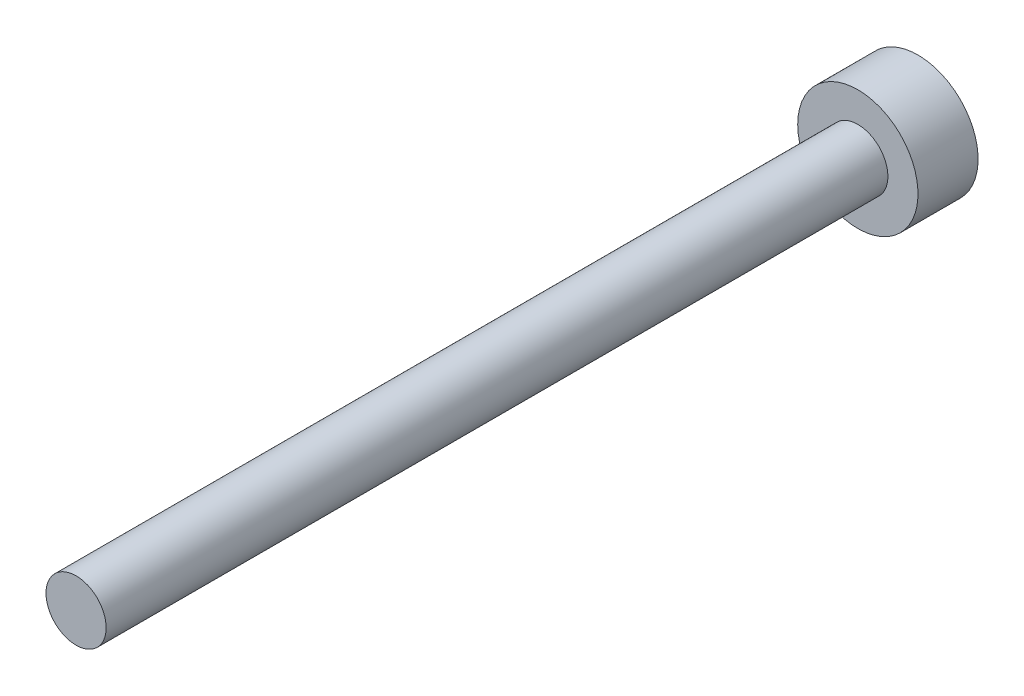
ISO-10303-21;
HEADER;
FILE_DESCRIPTION(('STEP AP214'),'2;1');
FILE_NAME('part.step','',(''),(''),'','','');
FILE_SCHEMA(('AUTOMOTIVE_DESIGN { 1 0 10303 214 1 1 1 1 }'));
ENDSEC;
DATA;
#1=APPLICATION_CONTEXT('core data for automotive mechanical design processes');
#2=APPLICATION_PROTOCOL_DEFINITION('international standard','automotive_design',2000,#1);
#3=PRODUCT_CONTEXT('',#1,'mechanical');
#4=PRODUCT('Part','Part','',(#3));
#5=PRODUCT_RELATED_PRODUCT_CATEGORY('part','',(#4));
#6=PRODUCT_DEFINITION_FORMATION('','',#4);
#7=PRODUCT_DEFINITION_CONTEXT('part definition',#1,'design');
#8=PRODUCT_DEFINITION('design','',#6,#7);
#9=PRODUCT_DEFINITION_SHAPE('','',#8);
#10=(LENGTH_UNIT() NAMED_UNIT(*) SI_UNIT(.MILLI.,.METRE.));
#11=(NAMED_UNIT(*) PLANE_ANGLE_UNIT() SI_UNIT($,.RADIAN.));
#12=(NAMED_UNIT(*) SI_UNIT($,.STERADIAN.) SOLID_ANGLE_UNIT());
#13=UNCERTAINTY_MEASURE_WITH_UNIT(LENGTH_MEASURE(1.E-05),#10,'distance_accuracy_value','');
#14=(GEOMETRIC_REPRESENTATION_CONTEXT(3) GLOBAL_UNCERTAINTY_ASSIGNED_CONTEXT((#13)) GLOBAL_UNIT_ASSIGNED_CONTEXT((#10,
#11,#12)) REPRESENTATION_CONTEXT('',''));
#15=CARTESIAN_POINT('',(0.,0.,0.));
#16=DIRECTION('',(0.,0.,1.));
#17=DIRECTION('',(1.,0.,0.));
#18=AXIS2_PLACEMENT_3D('',#15,#16,#17);
#19=CARTESIAN_POINT('',(0.,0.,52.));
#20=DIRECTION('',(0.,0.,-1.));
#21=DIRECTION('',(-1.,0.,0.));
#22=AXIS2_PLACEMENT_3D('',#19,#20,#21);
#23=CYLINDRICAL_SURFACE('',#22,2.);
#24=CARTESIAN_POINT('',(0.,0.,52.));
#25=DIRECTION('',(0.,0.,1.));
#26=DIRECTION('',(1.,0.,0.));
#27=AXIS2_PLACEMENT_3D('',#24,#25,#26);
#28=CIRCLE('',#27,2.);
#29=CARTESIAN_POINT('',(-2.,0.,52.));
#30=VERTEX_POINT('',#29);
#31=EDGE_CURVE('E11',#30,#30,#28,.T.);
#32=CARTESIAN_POINT('',(0.,0.,0.));
#33=DIRECTION('',(0.,0.,1.));
#34=DIRECTION('',(1.,0.,0.));
#35=AXIS2_PLACEMENT_3D('',#32,#33,#34);
#36=CIRCLE('',#35,2.);
#37=CARTESIAN_POINT('',(-2.,0.,0.));
#38=VERTEX_POINT('',#37);
#39=EDGE_CURVE('E35',#38,#38,#36,.T.);
#40=CARTESIAN_POINT('',(-2.,0.,52.));
#41=CARTESIAN_POINT('',(-2.,0.,51.4583333333333));
#42=CARTESIAN_POINT('',(-2.,0.,50.9166666666667));
#43=CARTESIAN_POINT('',(-2.,0.,49.8333333333333));
#44=CARTESIAN_POINT('',(-2.,0.,49.2916666666667));
#45=CARTESIAN_POINT('',(-2.,0.,48.2083333333333));
#46=CARTESIAN_POINT('',(-2.,0.,47.6666666666667));
#47=CARTESIAN_POINT('',(-2.,0.,46.5833333333333));
#48=CARTESIAN_POINT('',(-2.,0.,46.0416666666667));
#49=CARTESIAN_POINT('',(-2.,0.,44.9583333333333));
#50=CARTESIAN_POINT('',(-2.,0.,44.4166666666667));
#51=CARTESIAN_POINT('',(-2.,0.,43.3333333333333));
#52=CARTESIAN_POINT('',(-2.,0.,42.7916666666667));
#53=CARTESIAN_POINT('',(-2.,0.,41.7083333333333));
#54=CARTESIAN_POINT('',(-2.,0.,41.1666666666667));
#55=CARTESIAN_POINT('',(-2.,0.,40.0833333333333));
#56=CARTESIAN_POINT('',(-2.,0.,39.5416666666667));
#57=CARTESIAN_POINT('',(-2.,0.,38.4583333333333));
#58=CARTESIAN_POINT('',(-2.,0.,37.9166666666667));
#59=CARTESIAN_POINT('',(-2.,0.,36.8333333333333));
#60=CARTESIAN_POINT('',(-2.,0.,36.2916666666667));
#61=CARTESIAN_POINT('',(-2.,0.,35.2083333333333));
#62=CARTESIAN_POINT('',(-2.,0.,34.6666666666667));
#63=CARTESIAN_POINT('',(-2.,0.,33.5833333333333));
#64=CARTESIAN_POINT('',(-2.,0.,33.0416666666667));
#65=CARTESIAN_POINT('',(-2.,0.,31.9583333333333));
#66=CARTESIAN_POINT('',(-2.,0.,31.4166666666667));
#67=CARTESIAN_POINT('',(-2.,0.,30.3333333333333));
#68=CARTESIAN_POINT('',(-2.,0.,29.7916666666667));
#69=CARTESIAN_POINT('',(-2.,0.,28.7083333333333));
#70=CARTESIAN_POINT('',(-2.,0.,28.1666666666667));
#71=CARTESIAN_POINT('',(-2.,0.,27.0833333333333));
#72=CARTESIAN_POINT('',(-2.,0.,26.5416666666667));
#73=CARTESIAN_POINT('',(-2.,0.,25.4583333333333));
#74=CARTESIAN_POINT('',(-2.,0.,24.9166666666667));
#75=CARTESIAN_POINT('',(-2.,0.,23.8333333333333));
#76=CARTESIAN_POINT('',(-2.,0.,23.2916666666667));
#77=CARTESIAN_POINT('',(-2.,0.,22.2083333333333));
#78=CARTESIAN_POINT('',(-2.,0.,21.6666666666667));
#79=CARTESIAN_POINT('',(-2.,0.,20.5833333333333));
#80=CARTESIAN_POINT('',(-2.,0.,20.0416666666667));
#81=CARTESIAN_POINT('',(-2.,0.,18.9583333333333));
#82=CARTESIAN_POINT('',(-2.,0.,18.4166666666667));
#83=CARTESIAN_POINT('',(-2.,0.,17.3333333333333));
#84=CARTESIAN_POINT('',(-2.,0.,16.7916666666667));
#85=CARTESIAN_POINT('',(-2.,0.,15.7083333333333));
#86=CARTESIAN_POINT('',(-2.,0.,15.1666666666667));
#87=CARTESIAN_POINT('',(-2.,0.,14.0833333333333));
#88=CARTESIAN_POINT('',(-2.,0.,13.5416666666667));
#89=CARTESIAN_POINT('',(-2.,0.,12.4583333333333));
#90=CARTESIAN_POINT('',(-2.,0.,11.9166666666667));
#91=CARTESIAN_POINT('',(-2.,0.,10.8333333333333));
#92=CARTESIAN_POINT('',(-2.,0.,10.2916666666667));
#93=CARTESIAN_POINT('',(-2.,0.,9.20833333333333));
#94=CARTESIAN_POINT('',(-2.,0.,8.66666666666667));
#95=CARTESIAN_POINT('',(-2.,0.,7.58333333333333));
#96=CARTESIAN_POINT('',(-2.,0.,7.04166666666667));
#97=CARTESIAN_POINT('',(-2.,0.,5.95833333333333));
#98=CARTESIAN_POINT('',(-2.,0.,5.41666666666667));
#99=CARTESIAN_POINT('',(-2.,0.,4.33333333333333));
#100=CARTESIAN_POINT('',(-2.,0.,3.79166666666667));
#101=CARTESIAN_POINT('',(-2.,0.,2.70833333333334));
#102=CARTESIAN_POINT('',(-2.,0.,2.16666666666667));
#103=CARTESIAN_POINT('',(-2.,0.,1.08333333333333));
#104=CARTESIAN_POINT('',(-2.,0.,0.541666666666667));
#105=CARTESIAN_POINT('',(-2.,0.,0.));
#106=B_SPLINE_CURVE_WITH_KNOTS('',3,(#40,#41,#42,#43,#44,#45,#46,#47,#48,#49,#50,#51,#52,#53,
#54,#55,#56,#57,#58,#59,#60,#61,#62,#63,#64,#65,#66,#67,#68,#69,#70,#71,#72,#73,#74,#75,#76,#77,
#78,#79,#80,#81,#82,#83,#84,#85,#86,#87,#88,#89,#90,#91,#92,#93,#94,#95,#96,#97,#98,#99,#100,
#101,#102,#103,#104,#105),.UNSPECIFIED.,.F.,.F.,(4,2,2,2,2,2,2,2,2,2,2,2,2,2,2,2,2,2,2,2,2,2,2,
2,2,2,2,2,2,2,2,2,4),(0.,1.62499999999999,3.25,4.875,6.49999999999999,8.12499999999999,
9.74999999999999,11.375,13.,14.625,16.25,17.875,19.5,21.125,22.75,24.375,26.,27.625,29.25,
30.875,32.5,34.125,35.75,37.375,39.,40.625,42.25,43.875,45.5,47.125,48.75,50.375,52.),.UNSPECIFIED.);
#107=EDGE_CURVE('BSEAM32',#30,#38,#106,.T.);
#108=ORIENTED_EDGE('',*,*,#31,.F.);
#109=ORIENTED_EDGE('',*,*,#39,.T.);
#110=ORIENTED_EDGE('',*,*,#107,.T.);
#111=ORIENTED_EDGE('',*,*,#107,.F.);
#112=EDGE_LOOP('',(#108,#110,#109,#111));
#113=FACE_BOUND('',#112,.T.);
#114=ADVANCED_FACE('F32',(#113),#23,.T.);
#115=CARTESIAN_POINT('',(0.,0.,52.));
#116=DIRECTION('',(0.,0.,1.));
#117=DIRECTION('',(1.,0.,0.));
#118=AXIS2_PLACEMENT_3D('',#115,#116,#117);
#119=PLANE('',#118);
#120=ORIENTED_EDGE('',*,*,#31,.T.);
#121=EDGE_LOOP('',(#120));
#122=FACE_BOUND('',#121,.T.);
#123=ADVANCED_FACE('F164',(#122),#119,.T.);
#124=CARTESIAN_POINT('',(0.,0.,-4.));
#125=DIRECTION('',(0.,0.,1.));
#126=DIRECTION('',(1.,0.,0.));
#127=AXIS2_PLACEMENT_3D('',#124,#125,#126);
#128=CYLINDRICAL_SURFACE('',#127,4.);
#129=CARTESIAN_POINT('',(0.,0.,-4.));
#130=DIRECTION('',(0.,0.,-1.));
#131=DIRECTION('',(-1.,0.,0.));
#132=AXIS2_PLACEMENT_3D('',#129,#130,#131);
#133=CIRCLE('',#132,4.);
#134=CARTESIAN_POINT('',(-4.,0.,-4.));
#135=VERTEX_POINT('',#134);
#136=EDGE_CURVE('E139',#135,#135,#133,.T.);
#137=ORIENTED_EDGE('',*,*,#136,.F.);
#138=EDGE_LOOP('',(#137));
#139=FACE_BOUND('',#138,.T.);
#140=CARTESIAN_POINT('',(0.,0.,0.));
#141=DIRECTION('',(0.,0.,-1.));
#142=DIRECTION('',(-1.,0.,0.));
#143=AXIS2_PLACEMENT_3D('',#140,#141,#142);
#144=CIRCLE('',#143,4.);
#145=CARTESIAN_POINT('',(-4.,0.,0.));
#146=VERTEX_POINT('',#145);
#147=EDGE_CURVE('E133',#146,#146,#144,.T.);
#148=ORIENTED_EDGE('',*,*,#147,.T.);
#149=EDGE_LOOP('',(#148));
#150=FACE_BOUND('',#149,.T.);
#151=ADVANCED_FACE('F145',(#139,#150),#128,.T.);
#152=CARTESIAN_POINT('',(0.,0.,-4.));
#153=DIRECTION('',(0.,0.,-1.));
#154=DIRECTION('',(-1.,0.,0.));
#155=AXIS2_PLACEMENT_3D('',#152,#153,#154);
#156=PLANE('',#155);
#157=DIRECTION('',(-0.5,0.866025403784439,0.));
#158=VECTOR('',#157,1.);
#159=CARTESIAN_POINT('',(-1.,-1.73205080756888,-4.));
#160=LINE('',#159,#158);
#161=CARTESIAN_POINT('',(-1.,-1.73205080756888,-4.));
#162=VERTEX_POINT('',#161);
#163=CARTESIAN_POINT('',(-2.,0.,-4.));
#164=VERTEX_POINT('',#163);
#165=EDGE_CURVE('E46',#162,#164,#160,.T.);
#166=ORIENTED_EDGE('',*,*,#165,.F.);
#167=DIRECTION('',(-1.,0.,0.));
#168=VECTOR('',#167,1.);
#169=CARTESIAN_POINT('',(1.,-1.73205080756888,-4.));
#170=LINE('',#169,#168);
#171=CARTESIAN_POINT('',(1.,-1.73205080756888,-4.));
#172=VERTEX_POINT('',#171);
#173=EDGE_CURVE('E129',#172,#162,#170,.T.);
#174=ORIENTED_EDGE('',*,*,#173,.F.);
#175=DIRECTION('',(-0.5,-0.866025403784438,0.));
#176=VECTOR('',#175,1.);
#177=CARTESIAN_POINT('',(2.,0.,-4.));
#178=LINE('',#177,#176);
#179=CARTESIAN_POINT('',(2.,0.,-4.));
#180=VERTEX_POINT('',#179);
#181=EDGE_CURVE('E127',#180,#172,#178,.T.);
#182=ORIENTED_EDGE('',*,*,#181,.F.);
#183=DIRECTION('',(0.5,-0.866025403784439,0.));
#184=VECTOR('',#183,1.);
#185=CARTESIAN_POINT('',(1.,1.73205080756888,-4.));
#186=LINE('',#185,#184);
#187=CARTESIAN_POINT('',(1.,1.73205080756888,-4.));
#188=VERTEX_POINT('',#187);
#189=EDGE_CURVE('E94',#188,#180,#186,.T.);
#190=ORIENTED_EDGE('',*,*,#189,.F.);
#191=DIRECTION('',(1.,0.,0.));
#192=VECTOR('',#191,1.);
#193=CARTESIAN_POINT('',(-1.,1.73205080756888,-4.));
#194=LINE('',#193,#192);
#195=CARTESIAN_POINT('',(-1.,1.73205080756888,-4.));
#196=VERTEX_POINT('',#195);
#197=EDGE_CURVE('E123',#196,#188,#194,.T.);
#198=ORIENTED_EDGE('',*,*,#197,.F.);
#199=DIRECTION('',(0.5,0.866025403784439,0.));
#200=VECTOR('',#199,1.);
#201=CARTESIAN_POINT('',(-2.,0.,-4.));
#202=LINE('',#201,#200);
#203=EDGE_CURVE('E120',#164,#196,#202,.T.);
#204=ORIENTED_EDGE('',*,*,#203,.F.);
#205=EDGE_LOOP('',(#166,#174,#182,#190,#198,#204));
#206=FACE_BOUND('',#205,.T.);
#207=ORIENTED_EDGE('',*,*,#136,.T.);
#208=EDGE_LOOP('',(#207));
#209=FACE_BOUND('',#208,.T.);
#210=ADVANCED_FACE('F150',(#206,#209),#156,.T.);
#211=CARTESIAN_POINT('',(0.,0.,0.));
#212=DIRECTION('',(0.,0.,-1.));
#213=DIRECTION('',(-1.,0.,0.));
#214=AXIS2_PLACEMENT_3D('',#211,#212,#213);
#215=PLANE('',#214);
#216=ORIENTED_EDGE('',*,*,#39,.F.);
#217=EDGE_LOOP('',(#216));
#218=FACE_BOUND('',#217,.T.);
#219=ORIENTED_EDGE('',*,*,#147,.F.);
#220=EDGE_LOOP('',(#219));
#221=FACE_BOUND('',#220,.T.);
#222=ADVANCED_FACE('F147',(#218,#221),#215,.F.);
#223=CARTESIAN_POINT('',(-1.,-1.73205080756888,-2.));
#224=DIRECTION('',(-0.866025403784439,-0.5,0.));
#225=DIRECTION('',(0.5,-0.866025403784439,0.));
#226=AXIS2_PLACEMENT_3D('',#223,#224,#225);
#227=PLANE('',#226);
#228=ORIENTED_EDGE('',*,*,#165,.T.);
#229=DIRECTION('',(0.,0.,-1.));
#230=VECTOR('',#229,1.);
#231=CARTESIAN_POINT('',(-2.,0.,-2.));
#232=LINE('',#231,#230);
#233=CARTESIAN_POINT('',(-2.,0.,-2.));
#234=VERTEX_POINT('',#233);
#235=EDGE_CURVE('E76',#234,#164,#232,.T.);
#236=ORIENTED_EDGE('',*,*,#235,.F.);
#237=DIRECTION('',(-0.5,0.866025403784439,0.));
#238=VECTOR('',#237,1.);
#239=CARTESIAN_POINT('',(-1.,-1.73205080756888,-2.));
#240=LINE('',#239,#238);
#241=CARTESIAN_POINT('',(-1.,-1.73205080756888,-2.));
#242=VERTEX_POINT('',#241);
#243=EDGE_CURVE('E131',#242,#234,#240,.T.);
#244=ORIENTED_EDGE('',*,*,#243,.F.);
#245=DIRECTION('',(0.,0.,-1.));
#246=VECTOR('',#245,1.);
#247=CARTESIAN_POINT('',(-1.,-1.73205080756888,-2.));
#248=LINE('',#247,#246);
#249=EDGE_CURVE('E54',#242,#162,#248,.T.);
#250=ORIENTED_EDGE('',*,*,#249,.T.);
#251=EDGE_LOOP('',(#228,#236,#244,#250));
#252=FACE_BOUND('',#251,.T.);
#253=ADVANCED_FACE('F149',(#252),#227,.F.);
#254=CARTESIAN_POINT('',(1.,-1.73205080756888,-2.));
#255=DIRECTION('',(0.,-1.,0.));
#256=DIRECTION('',(0.,0.,-1.));
#257=AXIS2_PLACEMENT_3D('',#254,#255,#256);
#258=PLANE('',#257);
#259=ORIENTED_EDGE('',*,*,#173,.T.);
#260=ORIENTED_EDGE('',*,*,#249,.F.);
#261=DIRECTION('',(-1.,0.,0.));
#262=VECTOR('',#261,1.);
#263=CARTESIAN_POINT('',(1.,-1.73205080756888,-2.));
#264=LINE('',#263,#262);
#265=CARTESIAN_POINT('',(1.,-1.73205080756888,-2.));
#266=VERTEX_POINT('',#265);
#267=EDGE_CURVE('E106',#266,#242,#264,.T.);
#268=ORIENTED_EDGE('',*,*,#267,.F.);
#269=DIRECTION('',(0.,0.,-1.));
#270=VECTOR('',#269,1.);
#271=CARTESIAN_POINT('',(1.,-1.73205080756888,-2.));
#272=LINE('',#271,#270);
#273=EDGE_CURVE('E98',#266,#172,#272,.T.);
#274=ORIENTED_EDGE('',*,*,#273,.T.);
#275=EDGE_LOOP('',(#259,#260,#268,#274));
#276=FACE_BOUND('',#275,.T.);
#277=ADVANCED_FACE('F157',(#276),#258,.F.);
#278=CARTESIAN_POINT('',(2.,0.,-2.));
#279=DIRECTION('',(0.866025403784438,-0.5,0.));
#280=DIRECTION('',(0.5,0.866025403784439,0.));
#281=AXIS2_PLACEMENT_3D('',#278,#279,#280);
#282=PLANE('',#281);
#283=ORIENTED_EDGE('',*,*,#181,.T.);
#284=ORIENTED_EDGE('',*,*,#273,.F.);
#285=DIRECTION('',(-0.5,-0.866025403784438,0.));
#286=VECTOR('',#285,1.);
#287=CARTESIAN_POINT('',(2.,0.,-2.));
#288=LINE('',#287,#286);
#289=CARTESIAN_POINT('',(2.,0.,-2.));
#290=VERTEX_POINT('',#289);
#291=EDGE_CURVE('E102',#290,#266,#288,.T.);
#292=ORIENTED_EDGE('',*,*,#291,.F.);
#293=DIRECTION('',(0.,0.,-1.));
#294=VECTOR('',#293,1.);
#295=CARTESIAN_POINT('',(2.,0.,-2.));
#296=LINE('',#295,#294);
#297=EDGE_CURVE('E87',#290,#180,#296,.T.);
#298=ORIENTED_EDGE('',*,*,#297,.T.);
#299=EDGE_LOOP('',(#283,#284,#292,#298));
#300=FACE_BOUND('',#299,.T.);
#301=ADVANCED_FACE('F103',(#300),#282,.F.);
#302=CARTESIAN_POINT('',(1.,1.73205080756888,-2.));
#303=DIRECTION('',(0.866025403784439,0.5,0.));
#304=DIRECTION('',(-0.5,0.866025403784439,0.));
#305=AXIS2_PLACEMENT_3D('',#302,#303,#304);
#306=PLANE('',#305);
#307=ORIENTED_EDGE('',*,*,#189,.T.);
#308=ORIENTED_EDGE('',*,*,#297,.F.);
#309=DIRECTION('',(0.5,-0.866025403784439,0.));
#310=VECTOR('',#309,1.);
#311=CARTESIAN_POINT('',(1.,1.73205080756888,-2.));
#312=LINE('',#311,#310);
#313=CARTESIAN_POINT('',(1.,1.73205080756888,-2.));
#314=VERTEX_POINT('',#313);
#315=EDGE_CURVE('E91',#314,#290,#312,.T.);
#316=ORIENTED_EDGE('',*,*,#315,.F.);
#317=DIRECTION('',(0.,0.,-1.));
#318=VECTOR('',#317,1.);
#319=CARTESIAN_POINT('',(1.,1.73205080756888,-2.));
#320=LINE('',#319,#318);
#321=EDGE_CURVE('E99',#314,#188,#320,.T.);
#322=ORIENTED_EDGE('',*,*,#321,.T.);
#323=EDGE_LOOP('',(#307,#308,#316,#322));
#324=FACE_BOUND('',#323,.T.);
#325=ADVANCED_FACE('F89',(#324),#306,.F.);
#326=CARTESIAN_POINT('',(-1.,1.73205080756888,-2.));
#327=DIRECTION('',(0.,1.,0.));
#328=DIRECTION('',(-1.,0.,0.));
#329=AXIS2_PLACEMENT_3D('',#326,#327,#328);
#330=PLANE('',#329);
#331=ORIENTED_EDGE('',*,*,#197,.T.);
#332=ORIENTED_EDGE('',*,*,#321,.F.);
#333=DIRECTION('',(1.,0.,0.));
#334=VECTOR('',#333,1.);
#335=CARTESIAN_POINT('',(-1.,1.73205080756888,-2.));
#336=LINE('',#335,#334);
#337=CARTESIAN_POINT('',(-1.,1.73205080756888,-2.));
#338=VERTEX_POINT('',#337);
#339=EDGE_CURVE('E112',#338,#314,#336,.T.);
#340=ORIENTED_EDGE('',*,*,#339,.F.);
#341=DIRECTION('',(0.,0.,-1.));
#342=VECTOR('',#341,1.);
#343=CARTESIAN_POINT('',(-1.,1.73205080756888,-2.));
#344=LINE('',#343,#342);
#345=EDGE_CURVE('E136',#338,#196,#344,.T.);
#346=ORIENTED_EDGE('',*,*,#345,.T.);
#347=EDGE_LOOP('',(#331,#332,#340,#346));
#348=FACE_BOUND('',#347,.T.);
#349=ADVANCED_FACE('F218',(#348),#330,.F.);
#350=CARTESIAN_POINT('',(-2.,0.,-2.));
#351=DIRECTION('',(-0.866025403784439,0.5,0.));
#352=DIRECTION('',(-0.5,-0.866025403784439,0.));
#353=AXIS2_PLACEMENT_3D('',#350,#351,#352);
#354=PLANE('',#353);
#355=ORIENTED_EDGE('',*,*,#203,.T.);
#356=ORIENTED_EDGE('',*,*,#345,.F.);
#357=DIRECTION('',(0.5,0.866025403784439,0.));
#358=VECTOR('',#357,1.);
#359=CARTESIAN_POINT('',(-2.,0.,-2.));
#360=LINE('',#359,#358);
#361=EDGE_CURVE('E114',#234,#338,#360,.T.);
#362=ORIENTED_EDGE('',*,*,#361,.F.);
#363=ORIENTED_EDGE('',*,*,#235,.T.);
#364=EDGE_LOOP('',(#355,#356,#362,#363));
#365=FACE_BOUND('',#364,.T.);
#366=ADVANCED_FACE('F227',(#365),#354,.F.);
#367=CARTESIAN_POINT('',(0.,0.,-2.));
#368=DIRECTION('',(0.,0.,-1.));
#369=DIRECTION('',(-1.,0.,0.));
#370=AXIS2_PLACEMENT_3D('',#367,#368,#369);
#371=PLANE('',#370);
#372=ORIENTED_EDGE('',*,*,#243,.T.);
#373=ORIENTED_EDGE('',*,*,#361,.T.);
#374=ORIENTED_EDGE('',*,*,#339,.T.);
#375=ORIENTED_EDGE('',*,*,#315,.T.);
#376=ORIENTED_EDGE('',*,*,#291,.T.);
#377=ORIENTED_EDGE('',*,*,#267,.T.);
#378=EDGE_LOOP('',(#372,#373,#374,#375,#376,#377));
#379=FACE_BOUND('',#378,.T.);
#380=ADVANCED_FACE('F109',(#379),#371,.T.);
#381=CLOSED_SHELL('',(#114,#123,#151,#210,#222,#253,#277,#301,#325,#349,#366,#380));
#382=MANIFOLD_SOLID_BREP('B2',#381);
#383=ADVANCED_BREP_SHAPE_REPRESENTATION('',(#18,#382),#14);
#384=SHAPE_DEFINITION_REPRESENTATION(#9,#383);
ENDSEC;
END-ISO-10303-21;
